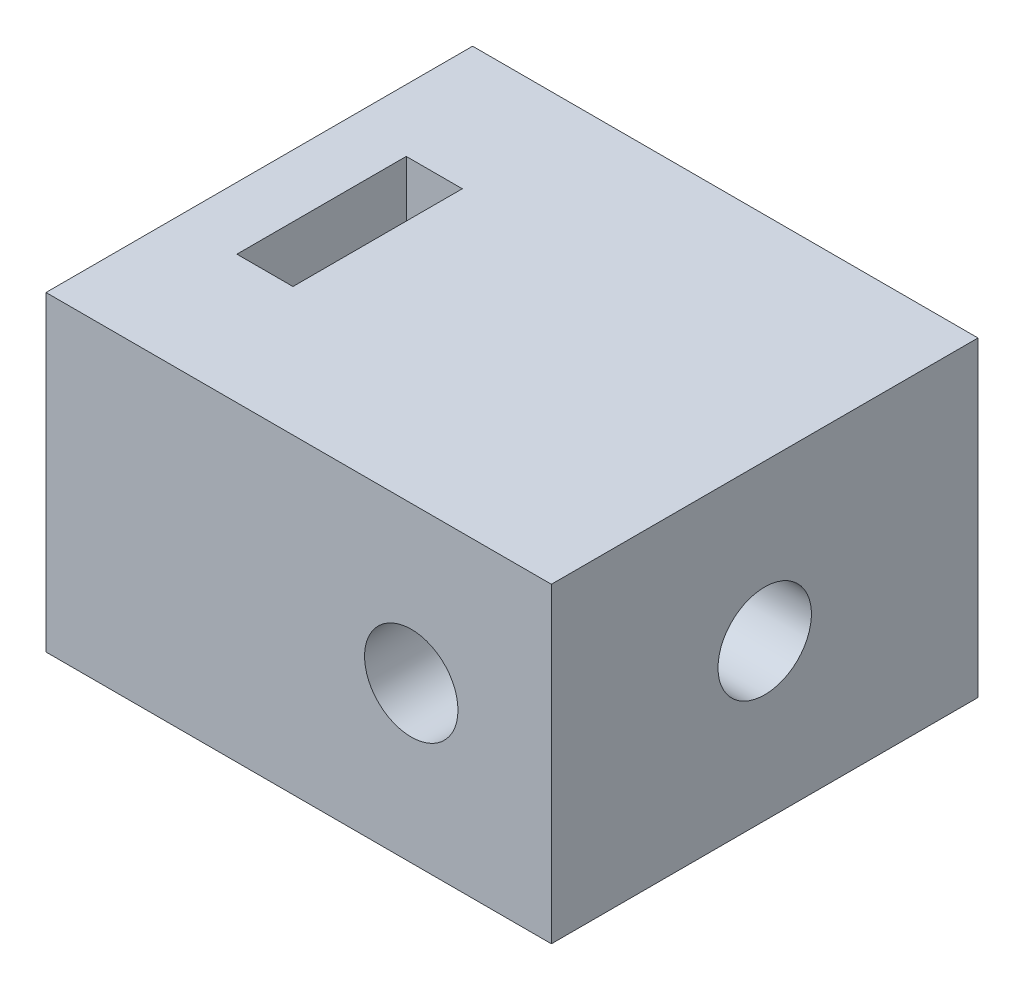
ISO-10303-21;
HEADER;
FILE_DESCRIPTION(('STEP AP214'),'2;1');
FILE_NAME('part.step','',(''),(''),'','','');
FILE_SCHEMA(('AUTOMOTIVE_DESIGN { 1 0 10303 214 1 1 1 1 }'));
ENDSEC;
DATA;
#1=APPLICATION_CONTEXT('core data for automotive mechanical design processes');
#2=APPLICATION_PROTOCOL_DEFINITION('international standard','automotive_design',2000,#1);
#3=PRODUCT_CONTEXT('',#1,'mechanical');
#4=PRODUCT('Part','Part','',(#3));
#5=PRODUCT_RELATED_PRODUCT_CATEGORY('part','',(#4));
#6=PRODUCT_DEFINITION_FORMATION('','',#4);
#7=PRODUCT_DEFINITION_CONTEXT('part definition',#1,'design');
#8=PRODUCT_DEFINITION('design','',#6,#7);
#9=PRODUCT_DEFINITION_SHAPE('','',#8);
#10=(LENGTH_UNIT() NAMED_UNIT(*) SI_UNIT(.MILLI.,.METRE.));
#11=(NAMED_UNIT(*) PLANE_ANGLE_UNIT() SI_UNIT($,.RADIAN.));
#12=(NAMED_UNIT(*) SI_UNIT($,.STERADIAN.) SOLID_ANGLE_UNIT());
#13=UNCERTAINTY_MEASURE_WITH_UNIT(LENGTH_MEASURE(1.E-05),#10,'distance_accuracy_value','');
#14=(GEOMETRIC_REPRESENTATION_CONTEXT(3) GLOBAL_UNCERTAINTY_ASSIGNED_CONTEXT((#13)) GLOBAL_UNIT_ASSIGNED_CONTEXT((#10,
#11,#12)) REPRESENTATION_CONTEXT('',''));
#15=CARTESIAN_POINT('',(0.,0.,0.));
#16=DIRECTION('',(0.,0.,1.));
#17=DIRECTION('',(1.,0.,0.));
#18=AXIS2_PLACEMENT_3D('',#15,#16,#17);
#19=CARTESIAN_POINT('',(8.205,5.,0.));
#20=DIRECTION('',(-1.,0.,0.));
#21=DIRECTION('',(0.,0.,1.));
#22=AXIS2_PLACEMENT_3D('',#19,#20,#21);
#23=CYLINDRICAL_SURFACE('',#22,1.5);
#24=CARTESIAN_POINT('',(3.705,5.,0.));
#25=DIRECTION('',(0.707106781186548,0.,0.707106781186547));
#26=DIRECTION('',(-0.707106781186548,0.,0.707106781186547));
#27=AXIS2_PLACEMENT_3D('',#24,#25,#26);
#28=ELLIPSE('',#27,2.12132034355964,1.5);
#29=CARTESIAN_POINT('',(3.705,3.5,0.));
#30=VERTEX_POINT('',#29);
#31=CARTESIAN_POINT('',(3.705,6.5,0.));
#32=VERTEX_POINT('',#31);
#33=EDGE_CURVE('E199',#30,#32,#28,.F.);
#34=ORIENTED_EDGE('',*,*,#33,.F.);
#35=CARTESIAN_POINT('',(3.705,5.,0.));
#36=DIRECTION('',(-0.707106781186548,0.,0.707106781186547));
#37=DIRECTION('',(0.707106781186548,0.,0.707106781186547));
#38=AXIS2_PLACEMENT_3D('',#35,#36,#37);
#39=ELLIPSE('',#38,2.12132034355964,1.5);
#40=EDGE_CURVE('E44',#32,#30,#39,.T.);
#41=ORIENTED_EDGE('',*,*,#40,.F.);
#42=EDGE_LOOP('',(#34,#41));
#43=FACE_BOUND('',#42,.T.);
#44=CARTESIAN_POINT('',(-4.225,5.,0.));
#45=DIRECTION('',(-1.,0.,0.));
#46=DIRECTION('',(0.,0.,1.));
#47=AXIS2_PLACEMENT_3D('',#44,#45,#46);
#48=CIRCLE('',#47,1.5);
#49=CARTESIAN_POINT('',(-4.225,5.,1.5));
#50=VERTEX_POINT('',#49);
#51=EDGE_CURVE('E39',#50,#50,#48,.F.);
#52=ORIENTED_EDGE('',*,*,#51,.F.);
#53=EDGE_LOOP('',(#52));
#54=FACE_BOUND('',#53,.T.);
#55=ADVANCED_FACE('F35',(#43,#54),#23,.F.);
#56=CARTESIAN_POINT('',(3.705,5.,-6.85));
#57=DIRECTION('',(0.,0.,1.));
#58=DIRECTION('',(1.,0.,0.));
#59=AXIS2_PLACEMENT_3D('',#56,#57,#58);
#60=CYLINDRICAL_SURFACE('',#59,1.5);
#61=CARTESIAN_POINT('',(3.705,5.,6.85));
#62=DIRECTION('',(0.,0.,1.));
#63=DIRECTION('',(1.,0.,0.));
#64=AXIS2_PLACEMENT_3D('',#61,#62,#63);
#65=CIRCLE('',#64,1.5);
#66=CARTESIAN_POINT('',(5.205,5.,6.85));
#67=VERTEX_POINT('',#66);
#68=EDGE_CURVE('E171',#67,#67,#65,.T.);
#69=ORIENTED_EDGE('',*,*,#68,.T.);
#70=EDGE_LOOP('',(#69));
#71=FACE_BOUND('',#70,.T.);
#72=ORIENTED_EDGE('',*,*,#33,.T.);
#73=CARTESIAN_POINT('',(3.705,5.,0.));
#74=DIRECTION('',(-0.707106781186548,0.,0.707106781186547));
#75=DIRECTION('',(0.707106781186548,0.,0.707106781186547));
#76=AXIS2_PLACEMENT_3D('',#73,#74,#75);
#77=ELLIPSE('',#76,2.12132034355964,1.5);
#78=EDGE_CURVE('E11',#32,#30,#77,.F.);
#79=ORIENTED_EDGE('',*,*,#78,.T.);
#80=EDGE_LOOP('',(#72,#79));
#81=FACE_BOUND('',#80,.T.);
#82=ADVANCED_FACE('F217',(#71,#81),#60,.F.);
#83=CARTESIAN_POINT('',(8.205,10.,-6.85));
#84=DIRECTION('',(-1.,0.,0.));
#85=DIRECTION('',(0.,0.,1.));
#86=AXIS2_PLACEMENT_3D('',#83,#84,#85);
#87=PLANE('',#86);
#88=CARTESIAN_POINT('',(8.205,5.,0.));
#89=DIRECTION('',(-1.,0.,0.));
#90=DIRECTION('',(0.,0.,1.));
#91=AXIS2_PLACEMENT_3D('',#88,#89,#90);
#92=CIRCLE('',#91,1.5);
#93=CARTESIAN_POINT('',(8.205,5.,1.5));
#94=VERTEX_POINT('',#93);
#95=EDGE_CURVE('E168',#94,#94,#92,.T.);
#96=ORIENTED_EDGE('',*,*,#95,.T.);
#97=EDGE_LOOP('',(#96));
#98=FACE_BOUND('',#97,.T.);
#99=DIRECTION('',(0.,0.,-1.));
#100=VECTOR('',#99,1.);
#101=CARTESIAN_POINT('',(8.205,0.,-6.85));
#102=LINE('',#101,#100);
#103=CARTESIAN_POINT('',(8.205,0.,6.85));
#104=VERTEX_POINT('',#103);
#105=CARTESIAN_POINT('',(8.205,0.,-6.85));
#106=VERTEX_POINT('',#105);
#107=EDGE_CURVE('E175',#104,#106,#102,.T.);
#108=ORIENTED_EDGE('',*,*,#107,.T.);
#109=DIRECTION('',(0.,-1.,0.));
#110=VECTOR('',#109,1.);
#111=CARTESIAN_POINT('',(8.205,10.,-6.85));
#112=LINE('',#111,#110);
#113=CARTESIAN_POINT('',(8.205,10.,-6.85));
#114=VERTEX_POINT('',#113);
#115=EDGE_CURVE('E196',#114,#106,#112,.T.);
#116=ORIENTED_EDGE('',*,*,#115,.F.);
#117=DIRECTION('',(0.,0.,-1.));
#118=VECTOR('',#117,1.);
#119=CARTESIAN_POINT('',(8.205,10.,-6.85));
#120=LINE('',#119,#118);
#121=CARTESIAN_POINT('',(8.205,10.,6.85));
#122=VERTEX_POINT('',#121);
#123=EDGE_CURVE('E178',#122,#114,#120,.T.);
#124=ORIENTED_EDGE('',*,*,#123,.F.);
#125=DIRECTION('',(0.,-1.,0.));
#126=VECTOR('',#125,1.);
#127=CARTESIAN_POINT('',(8.205,10.,6.85));
#128=LINE('',#127,#126);
#129=EDGE_CURVE('E187',#122,#104,#128,.T.);
#130=ORIENTED_EDGE('',*,*,#129,.T.);
#131=EDGE_LOOP('',(#108,#116,#124,#130));
#132=FACE_BOUND('',#131,.T.);
#133=ADVANCED_FACE('F37',(#98,#132),#87,.F.);
#134=CARTESIAN_POINT('',(-8.205,10.,-6.85));
#135=DIRECTION('',(0.,0.,1.));
#136=DIRECTION('',(1.,0.,0.));
#137=AXIS2_PLACEMENT_3D('',#134,#135,#136);
#138=PLANE('',#137);
#139=CARTESIAN_POINT('',(3.705,5.,-6.85));
#140=DIRECTION('',(0.,0.,1.));
#141=DIRECTION('',(1.,0.,0.));
#142=AXIS2_PLACEMENT_3D('',#139,#140,#141);
#143=CIRCLE('',#142,1.5);
#144=CARTESIAN_POINT('',(5.205,5.,-6.85));
#145=VERTEX_POINT('',#144);
#146=EDGE_CURVE('E172',#145,#145,#143,.T.);
#147=ORIENTED_EDGE('',*,*,#146,.T.);
#148=EDGE_LOOP('',(#147));
#149=FACE_BOUND('',#148,.T.);
#150=DIRECTION('',(-1.,0.,0.));
#151=VECTOR('',#150,1.);
#152=CARTESIAN_POINT('',(-8.205,0.,-6.85));
#153=LINE('',#152,#151);
#154=CARTESIAN_POINT('',(-8.025,0.,-6.85));
#155=VERTEX_POINT('',#154);
#156=EDGE_CURVE('E190',#106,#155,#153,.T.);
#157=ORIENTED_EDGE('',*,*,#156,.T.);
#158=DIRECTION('',(0.,1.,0.));
#159=VECTOR('',#158,1.);
#160=CARTESIAN_POINT('',(-8.025,0.,-6.85));
#161=LINE('',#160,#159);
#162=CARTESIAN_POINT('',(-8.025,10.,-6.85));
#163=VERTEX_POINT('',#162);
#164=EDGE_CURVE('E60',#155,#163,#161,.T.);
#165=ORIENTED_EDGE('',*,*,#164,.T.);
#166=DIRECTION('',(-1.,0.,0.));
#167=VECTOR('',#166,1.);
#168=CARTESIAN_POINT('',(-8.205,10.,-6.85));
#169=LINE('',#168,#167);
#170=EDGE_CURVE('E181',#114,#163,#169,.T.);
#171=ORIENTED_EDGE('',*,*,#170,.F.);
#172=ORIENTED_EDGE('',*,*,#115,.T.);
#173=EDGE_LOOP('',(#157,#165,#171,#172));
#174=FACE_BOUND('',#173,.T.);
#175=ADVANCED_FACE('F248',(#149,#174),#138,.F.);
#176=CARTESIAN_POINT('',(-8.205,10.,6.85));
#177=DIRECTION('',(0.,0.,-1.));
#178=DIRECTION('',(-1.,0.,0.));
#179=AXIS2_PLACEMENT_3D('',#176,#177,#178);
#180=PLANE('',#179);
#181=ORIENTED_EDGE('',*,*,#68,.F.);
#182=EDGE_LOOP('',(#181));
#183=FACE_BOUND('',#182,.T.);
#184=DIRECTION('',(1.,0.,0.));
#185=VECTOR('',#184,1.);
#186=CARTESIAN_POINT('',(-8.205,10.,6.85));
#187=LINE('',#186,#185);
#188=CARTESIAN_POINT('',(-8.025,10.,6.85));
#189=VERTEX_POINT('',#188);
#190=EDGE_CURVE('E185',#189,#122,#187,.T.);
#191=ORIENTED_EDGE('',*,*,#190,.F.);
#192=DIRECTION('',(0.,1.,0.));
#193=VECTOR('',#192,1.);
#194=CARTESIAN_POINT('',(-8.025,0.,6.85));
#195=LINE('',#194,#193);
#196=CARTESIAN_POINT('',(-8.025,0.,6.85));
#197=VERTEX_POINT('',#196);
#198=EDGE_CURVE('E162',#197,#189,#195,.T.);
#199=ORIENTED_EDGE('',*,*,#198,.F.);
#200=DIRECTION('',(1.,0.,0.));
#201=VECTOR('',#200,1.);
#202=CARTESIAN_POINT('',(-8.205,0.,6.85));
#203=LINE('',#202,#201);
#204=EDGE_CURVE('E182',#197,#104,#203,.T.);
#205=ORIENTED_EDGE('',*,*,#204,.T.);
#206=ORIENTED_EDGE('',*,*,#129,.F.);
#207=EDGE_LOOP('',(#191,#199,#205,#206));
#208=FACE_BOUND('',#207,.T.);
#209=ADVANCED_FACE('F251',(#183,#208),#180,.F.);
#210=CARTESIAN_POINT('',(0.,10.,0.));
#211=DIRECTION('',(0.,1.,0.));
#212=DIRECTION('',(0.,0.,1.));
#213=AXIS2_PLACEMENT_3D('',#210,#211,#212);
#214=PLANE('',#213);
#215=DIRECTION('',(-1.,0.,0.));
#216=VECTOR('',#215,1.);
#217=CARTESIAN_POINT('',(-4.225,10.,-2.71931976788314));
#218=LINE('',#217,#216);
#219=CARTESIAN_POINT('',(-4.225,10.,-2.71931976788314));
#220=VERTEX_POINT('',#219);
#221=CARTESIAN_POINT('',(-6.025,10.,-2.71931976788314));
#222=VERTEX_POINT('',#221);
#223=EDGE_CURVE('E52',#220,#222,#218,.T.);
#224=ORIENTED_EDGE('',*,*,#223,.F.);
#225=DIRECTION('',(0.,0.,-1.));
#226=VECTOR('',#225,1.);
#227=CARTESIAN_POINT('',(-4.225,10.,2.71931976788314));
#228=LINE('',#227,#226);
#229=CARTESIAN_POINT('',(-4.225,10.,2.71931976788314));
#230=VERTEX_POINT('',#229);
#231=EDGE_CURVE('E128',#230,#220,#228,.T.);
#232=ORIENTED_EDGE('',*,*,#231,.F.);
#233=DIRECTION('',(1.,0.,0.));
#234=VECTOR('',#233,1.);
#235=CARTESIAN_POINT('',(-6.025,10.,2.71931976788314));
#236=LINE('',#235,#234);
#237=CARTESIAN_POINT('',(-6.025,10.,2.71931976788314));
#238=VERTEX_POINT('',#237);
#239=EDGE_CURVE('E387',#238,#230,#236,.T.);
#240=ORIENTED_EDGE('',*,*,#239,.F.);
#241=DIRECTION('',(0.,0.,1.));
#242=VECTOR('',#241,1.);
#243=CARTESIAN_POINT('',(-6.025,10.,-2.71931976788314));
#244=LINE('',#243,#242);
#245=EDGE_CURVE('E389',#222,#238,#244,.T.);
#246=ORIENTED_EDGE('',*,*,#245,.F.);
#247=EDGE_LOOP('',(#224,#232,#240,#246));
#248=FACE_BOUND('',#247,.T.);
#249=DIRECTION('',(0.,0.,-1.));
#250=VECTOR('',#249,1.);
#251=CARTESIAN_POINT('',(-8.025,10.,-6.85));
#252=LINE('',#251,#250);
#253=EDGE_CURVE('E163',#189,#163,#252,.T.);
#254=ORIENTED_EDGE('',*,*,#253,.F.);
#255=ORIENTED_EDGE('',*,*,#190,.T.);
#256=ORIENTED_EDGE('',*,*,#123,.T.);
#257=ORIENTED_EDGE('',*,*,#170,.T.);
#258=EDGE_LOOP('',(#254,#255,#256,#257));
#259=FACE_BOUND('',#258,.T.);
#260=ADVANCED_FACE('F264',(#248,#259),#214,.T.);
#261=CARTESIAN_POINT('',(0.,0.,0.));
#262=DIRECTION('',(0.,1.,0.));
#263=DIRECTION('',(0.,0.,1.));
#264=AXIS2_PLACEMENT_3D('',#261,#262,#263);
#265=PLANE('',#264);
#266=ORIENTED_EDGE('',*,*,#204,.F.);
#267=DIRECTION('',(0.,0.,-1.));
#268=VECTOR('',#267,1.);
#269=CARTESIAN_POINT('',(-8.025,0.,-6.85));
#270=LINE('',#269,#268);
#271=EDGE_CURVE('E160',#197,#155,#270,.T.);
#272=ORIENTED_EDGE('',*,*,#271,.T.);
#273=ORIENTED_EDGE('',*,*,#156,.F.);
#274=ORIENTED_EDGE('',*,*,#107,.F.);
#275=EDGE_LOOP('',(#266,#272,#273,#274));
#276=FACE_BOUND('',#275,.T.);
#277=ADVANCED_FACE('F245',(#276),#265,.F.);
#278=CARTESIAN_POINT('',(3.705,5.,0.));
#279=DIRECTION('',(0.707106781186548,0.,0.707106781186547));
#280=DIRECTION('',(-0.707106781186548,0.,0.707106781186547));
#281=AXIS2_PLACEMENT_3D('',#278,#279,#280);
#282=ELLIPSE('',#281,2.12132034355964,1.5);
#283=EDGE_CURVE('E201',#30,#32,#282,.T.);
#284=ORIENTED_EDGE('',*,*,#283,.T.);
#285=ORIENTED_EDGE('',*,*,#40,.T.);
#286=EDGE_LOOP('',(#284,#285));
#287=FACE_BOUND('',#286,.T.);
#288=ORIENTED_EDGE('',*,*,#146,.F.);
#289=EDGE_LOOP('',(#288));
#290=FACE_BOUND('',#289,.T.);
#291=ADVANCED_FACE('F227',(#287,#290),#60,.F.);
#292=CARTESIAN_POINT('',(-6.025,5.,0.));
#293=DIRECTION('',(-1.,0.,0.));
#294=DIRECTION('',(0.,0.,1.));
#295=AXIS2_PLACEMENT_3D('',#292,#293,#294);
#296=CIRCLE('',#295,1.5);
#297=CARTESIAN_POINT('',(-6.025,5.,1.5));
#298=VERTEX_POINT('',#297);
#299=EDGE_CURVE('E155',#298,#298,#296,.F.);
#300=ORIENTED_EDGE('',*,*,#299,.T.);
#301=EDGE_LOOP('',(#300));
#302=FACE_BOUND('',#301,.T.);
#303=CARTESIAN_POINT('',(-8.025,5.,0.));
#304=DIRECTION('',(1.,0.,0.));
#305=DIRECTION('',(0.,0.,-1.));
#306=AXIS2_PLACEMENT_3D('',#303,#304,#305);
#307=CIRCLE('',#306,1.5);
#308=CARTESIAN_POINT('',(-8.025,5.,-1.5));
#309=VERTEX_POINT('',#308);
#310=EDGE_CURVE('E166',#309,#309,#307,.F.);
#311=ORIENTED_EDGE('',*,*,#310,.T.);
#312=EDGE_LOOP('',(#311));
#313=FACE_BOUND('',#312,.T.);
#314=ADVANCED_FACE('F220',(#302,#313),#23,.F.);
#315=ORIENTED_EDGE('',*,*,#95,.F.);
#316=EDGE_LOOP('',(#315));
#317=FACE_BOUND('',#316,.T.);
#318=ORIENTED_EDGE('',*,*,#283,.F.);
#319=ORIENTED_EDGE('',*,*,#78,.F.);
#320=EDGE_LOOP('',(#318,#319));
#321=FACE_BOUND('',#320,.T.);
#322=ADVANCED_FACE('F221',(#317,#321),#23,.F.);
#323=CARTESIAN_POINT('',(-8.025,0.,-6.85));
#324=DIRECTION('',(1.,0.,0.));
#325=DIRECTION('',(0.,0.,-1.));
#326=AXIS2_PLACEMENT_3D('',#323,#324,#325);
#327=PLANE('',#326);
#328=ORIENTED_EDGE('',*,*,#253,.T.);
#329=ORIENTED_EDGE('',*,*,#164,.F.);
#330=ORIENTED_EDGE('',*,*,#271,.F.);
#331=ORIENTED_EDGE('',*,*,#198,.T.);
#332=EDGE_LOOP('',(#328,#329,#330,#331));
#333=FACE_BOUND('',#332,.T.);
#334=ORIENTED_EDGE('',*,*,#310,.F.);
#335=EDGE_LOOP('',(#334));
#336=FACE_BOUND('',#335,.T.);
#337=ADVANCED_FACE('F232',(#333,#336),#327,.F.);
#338=CARTESIAN_POINT('',(-4.225,0.,0.));
#339=DIRECTION('',(-1.,0.,0.));
#340=DIRECTION('',(0.,0.,1.));
#341=AXIS2_PLACEMENT_3D('',#338,#339,#340);
#342=PLANE('',#341);
#343=ORIENTED_EDGE('',*,*,#51,.T.);
#344=EDGE_LOOP('',(#343));
#345=FACE_BOUND('',#344,.T.);
#346=DIRECTION('',(0.,1.,0.));
#347=VECTOR('',#346,1.);
#348=CARTESIAN_POINT('',(-4.225,5.,-2.71931976788314));
#349=LINE('',#348,#347);
#350=CARTESIAN_POINT('',(-4.225,5.,-2.71931976788314));
#351=VERTEX_POINT('',#350);
#352=EDGE_CURVE('E149',#351,#220,#349,.T.);
#353=ORIENTED_EDGE('',*,*,#352,.F.);
#354=DIRECTION('',(0.,-0.866025403784439,0.5));
#355=VECTOR('',#354,1.);
#356=CARTESIAN_POINT('',(-4.225,5.,-2.71931976788314));
#357=LINE('',#356,#355);
#358=CARTESIAN_POINT('',(-4.225,2.645,-1.35965988394157));
#359=VERTEX_POINT('',#358);
#360=EDGE_CURVE('E136',#351,#359,#357,.T.);
#361=ORIENTED_EDGE('',*,*,#360,.T.);
#362=DIRECTION('',(0.,0.,1.));
#363=VECTOR('',#362,1.);
#364=CARTESIAN_POINT('',(-4.225,2.645,-1.35965988394157));
#365=LINE('',#364,#363);
#366=CARTESIAN_POINT('',(-4.225,2.645,1.35965988394157));
#367=VERTEX_POINT('',#366);
#368=EDGE_CURVE('E159',#359,#367,#365,.T.);
#369=ORIENTED_EDGE('',*,*,#368,.T.);
#370=DIRECTION('',(0.,0.866025403784439,0.5));
#371=VECTOR('',#370,1.);
#372=CARTESIAN_POINT('',(-4.225,2.645,1.35965988394157));
#373=LINE('',#372,#371);
#374=CARTESIAN_POINT('',(-4.225,5.,2.71931976788314));
#375=VERTEX_POINT('',#374);
#376=EDGE_CURVE('E146',#367,#375,#373,.T.);
#377=ORIENTED_EDGE('',*,*,#376,.T.);
#378=DIRECTION('',(0.,1.,0.));
#379=VECTOR('',#378,1.);
#380=CARTESIAN_POINT('',(-4.225,5.,2.71931976788314));
#381=LINE('',#380,#379);
#382=EDGE_CURVE('E383',#375,#230,#381,.T.);
#383=ORIENTED_EDGE('',*,*,#382,.T.);
#384=ORIENTED_EDGE('',*,*,#231,.T.);
#385=EDGE_LOOP('',(#353,#361,#369,#377,#383,#384));
#386=FACE_BOUND('',#385,.T.);
#387=ADVANCED_FACE('F213',(#345,#386),#342,.T.);
#388=CARTESIAN_POINT('',(-6.025,0.,0.));
#389=DIRECTION('',(-1.,0.,0.));
#390=DIRECTION('',(0.,0.,1.));
#391=AXIS2_PLACEMENT_3D('',#388,#389,#390);
#392=PLANE('',#391);
#393=ORIENTED_EDGE('',*,*,#299,.F.);
#394=EDGE_LOOP('',(#393));
#395=FACE_BOUND('',#394,.T.);
#396=DIRECTION('',(0.,1.,0.));
#397=VECTOR('',#396,1.);
#398=CARTESIAN_POINT('',(-6.025,5.,2.71931976788314));
#399=LINE('',#398,#397);
#400=CARTESIAN_POINT('',(-6.025,5.,2.71931976788314));
#401=VERTEX_POINT('',#400);
#402=EDGE_CURVE('E127',#401,#238,#399,.T.);
#403=ORIENTED_EDGE('',*,*,#402,.F.);
#404=DIRECTION('',(0.,0.866025403784439,0.5));
#405=VECTOR('',#404,1.);
#406=CARTESIAN_POINT('',(-6.025,2.645,1.35965988394157));
#407=LINE('',#406,#405);
#408=CARTESIAN_POINT('',(-6.025,2.645,1.35965988394157));
#409=VERTEX_POINT('',#408);
#410=EDGE_CURVE('E144',#409,#401,#407,.T.);
#411=ORIENTED_EDGE('',*,*,#410,.F.);
#412=DIRECTION('',(0.,0.,1.));
#413=VECTOR('',#412,1.);
#414=CARTESIAN_POINT('',(-6.025,2.645,-1.35965988394157));
#415=LINE('',#414,#413);
#416=CARTESIAN_POINT('',(-6.025,2.645,-1.35965988394157));
#417=VERTEX_POINT('',#416);
#418=EDGE_CURVE('E143',#417,#409,#415,.T.);
#419=ORIENTED_EDGE('',*,*,#418,.F.);
#420=DIRECTION('',(0.,-0.866025403784439,0.5));
#421=VECTOR('',#420,1.);
#422=CARTESIAN_POINT('',(-6.025,5.,-2.71931976788314));
#423=LINE('',#422,#421);
#424=CARTESIAN_POINT('',(-6.025,5.,-2.71931976788314));
#425=VERTEX_POINT('',#424);
#426=EDGE_CURVE('E133',#425,#417,#423,.T.);
#427=ORIENTED_EDGE('',*,*,#426,.F.);
#428=DIRECTION('',(0.,1.,0.));
#429=VECTOR('',#428,1.);
#430=CARTESIAN_POINT('',(-6.025,5.,-2.71931976788314));
#431=LINE('',#430,#429);
#432=EDGE_CURVE('E118',#425,#222,#431,.T.);
#433=ORIENTED_EDGE('',*,*,#432,.T.);
#434=ORIENTED_EDGE('',*,*,#245,.T.);
#435=EDGE_LOOP('',(#403,#411,#419,#427,#433,#434));
#436=FACE_BOUND('',#435,.T.);
#437=ADVANCED_FACE('F140',(#395,#436),#392,.F.);
#438=CARTESIAN_POINT('',(-4.225,2.645,1.35965988394157));
#439=DIRECTION('',(0.,-0.5,0.866025403784438));
#440=DIRECTION('',(0.,-0.866025403784439,-0.5));
#441=AXIS2_PLACEMENT_3D('',#438,#439,#440);
#442=PLANE('',#441);
#443=ORIENTED_EDGE('',*,*,#410,.T.);
#444=DIRECTION('',(-1.,0.,0.));
#445=VECTOR('',#444,1.);
#446=CARTESIAN_POINT('',(-4.225,5.,2.71931976788314));
#447=LINE('',#446,#445);
#448=EDGE_CURVE('E138',#375,#401,#447,.T.);
#449=ORIENTED_EDGE('',*,*,#448,.F.);
#450=ORIENTED_EDGE('',*,*,#376,.F.);
#451=DIRECTION('',(-1.,0.,0.));
#452=VECTOR('',#451,1.);
#453=CARTESIAN_POINT('',(-4.225,2.645,1.35965988394157));
#454=LINE('',#453,#452);
#455=EDGE_CURVE('E153',#367,#409,#454,.T.);
#456=ORIENTED_EDGE('',*,*,#455,.T.);
#457=EDGE_LOOP('',(#443,#449,#450,#456));
#458=FACE_BOUND('',#457,.T.);
#459=ADVANCED_FACE('F326',(#458),#442,.F.);
#460=CARTESIAN_POINT('',(-4.225,2.645,-1.35965988394157));
#461=DIRECTION('',(0.,-1.,0.));
#462=DIRECTION('',(0.,0.,-1.));
#463=AXIS2_PLACEMENT_3D('',#460,#461,#462);
#464=PLANE('',#463);
#465=ORIENTED_EDGE('',*,*,#418,.T.);
#466=ORIENTED_EDGE('',*,*,#455,.F.);
#467=ORIENTED_EDGE('',*,*,#368,.F.);
#468=DIRECTION('',(-1.,0.,0.));
#469=VECTOR('',#468,1.);
#470=CARTESIAN_POINT('',(-4.225,2.645,-1.35965988394157));
#471=LINE('',#470,#469);
#472=EDGE_CURVE('E137',#359,#417,#471,.T.);
#473=ORIENTED_EDGE('',*,*,#472,.T.);
#474=EDGE_LOOP('',(#465,#466,#467,#473));
#475=FACE_BOUND('',#474,.T.);
#476=ADVANCED_FACE('F338',(#475),#464,.F.);
#477=CARTESIAN_POINT('',(-4.225,5.,-2.71931976788314));
#478=DIRECTION('',(0.,-0.5,-0.866025403784439));
#479=DIRECTION('',(0.,0.866025403784439,-0.5));
#480=AXIS2_PLACEMENT_3D('',#477,#478,#479);
#481=PLANE('',#480);
#482=ORIENTED_EDGE('',*,*,#426,.T.);
#483=ORIENTED_EDGE('',*,*,#472,.F.);
#484=ORIENTED_EDGE('',*,*,#360,.F.);
#485=DIRECTION('',(-1.,0.,0.));
#486=VECTOR('',#485,1.);
#487=CARTESIAN_POINT('',(-4.225,5.,-2.71931976788314));
#488=LINE('',#487,#486);
#489=EDGE_CURVE('E121',#351,#425,#488,.T.);
#490=ORIENTED_EDGE('',*,*,#489,.T.);
#491=EDGE_LOOP('',(#482,#483,#484,#490));
#492=FACE_BOUND('',#491,.T.);
#493=ADVANCED_FACE('F132',(#492),#481,.F.);
#494=CARTESIAN_POINT('',(-4.225,5.,-2.71931976788314));
#495=DIRECTION('',(0.,0.,-1.));
#496=DIRECTION('',(-1.,0.,0.));
#497=AXIS2_PLACEMENT_3D('',#494,#495,#496);
#498=PLANE('',#497);
#499=ORIENTED_EDGE('',*,*,#223,.T.);
#500=ORIENTED_EDGE('',*,*,#432,.F.);
#501=ORIENTED_EDGE('',*,*,#489,.F.);
#502=ORIENTED_EDGE('',*,*,#352,.T.);
#503=EDGE_LOOP('',(#499,#500,#501,#502));
#504=FACE_BOUND('',#503,.T.);
#505=ADVANCED_FACE('F120',(#504),#498,.F.);
#506=CARTESIAN_POINT('',(-6.025,5.,2.71931976788314));
#507=DIRECTION('',(0.,0.,1.));
#508=DIRECTION('',(1.,0.,0.));
#509=AXIS2_PLACEMENT_3D('',#506,#507,#508);
#510=PLANE('',#509);
#511=ORIENTED_EDGE('',*,*,#239,.T.);
#512=ORIENTED_EDGE('',*,*,#382,.F.);
#513=ORIENTED_EDGE('',*,*,#448,.T.);
#514=ORIENTED_EDGE('',*,*,#402,.T.);
#515=EDGE_LOOP('',(#511,#512,#513,#514));
#516=FACE_BOUND('',#515,.T.);
#517=ADVANCED_FACE('F356',(#516),#510,.F.);
#518=CLOSED_SHELL('',(#55,#82,#133,#175,#209,#260,#277,#291,#314,#322,#337,#387,#437,#459,#476,
#493,#505,#517));
#519=MANIFOLD_SOLID_BREP('B2',#518);
#520=ADVANCED_BREP_SHAPE_REPRESENTATION('',(#18,#519),#14);
#521=SHAPE_DEFINITION_REPRESENTATION(#9,#520);
ENDSEC;
END-ISO-10303-21;
